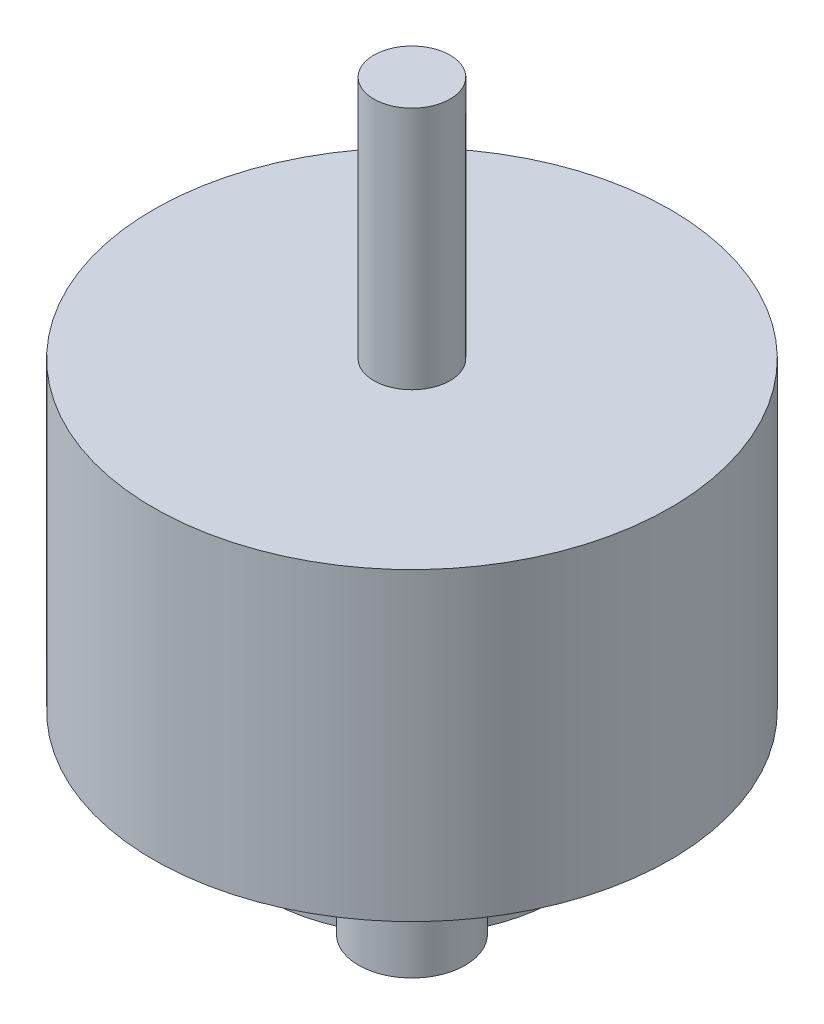
ISO-10303-21;
HEADER;
FILE_DESCRIPTION(('STEP AP214'),'2;1');
FILE_NAME('part.step','',(''),(''),'','','');
FILE_SCHEMA(('AUTOMOTIVE_DESIGN { 1 0 10303 214 1 1 1 1 }'));
ENDSEC;
DATA;
#1=APPLICATION_CONTEXT('core data for automotive mechanical design processes');
#2=APPLICATION_PROTOCOL_DEFINITION('international standard','automotive_design',2000,#1);
#3=PRODUCT_CONTEXT('',#1,'mechanical');
#4=PRODUCT('Part','Part','',(#3));
#5=PRODUCT_RELATED_PRODUCT_CATEGORY('part','',(#4));
#6=PRODUCT_DEFINITION_FORMATION('','',#4);
#7=PRODUCT_DEFINITION_CONTEXT('part definition',#1,'design');
#8=PRODUCT_DEFINITION('design','',#6,#7);
#9=PRODUCT_DEFINITION_SHAPE('','',#8);
#10=(LENGTH_UNIT() NAMED_UNIT(*) SI_UNIT(.MILLI.,.METRE.));
#11=(NAMED_UNIT(*) PLANE_ANGLE_UNIT() SI_UNIT($,.RADIAN.));
#12=(NAMED_UNIT(*) SI_UNIT($,.STERADIAN.) SOLID_ANGLE_UNIT());
#13=UNCERTAINTY_MEASURE_WITH_UNIT(LENGTH_MEASURE(1.E-05),#10,'distance_accuracy_value','');
#14=(GEOMETRIC_REPRESENTATION_CONTEXT(3) GLOBAL_UNCERTAINTY_ASSIGNED_CONTEXT((#13)) GLOBAL_UNIT_ASSIGNED_CONTEXT((#10,
#11,#12)) REPRESENTATION_CONTEXT('',''));
#15=CARTESIAN_POINT('',(0.,0.,0.));
#16=DIRECTION('',(0.,0.,1.));
#17=DIRECTION('',(1.,0.,0.));
#18=AXIS2_PLACEMENT_3D('',#15,#16,#17);
#19=CARTESIAN_POINT('',(0.,0.,0.));
#20=DIRECTION('',(0.,1.,0.));
#21=DIRECTION('',(0.,0.,1.));
#22=AXIS2_PLACEMENT_3D('',#19,#20,#21);
#23=PLANE('',#22);
#24=CARTESIAN_POINT('',(-6.71751442127217,0.,-6.71751442127224));
#25=DIRECTION('',(0.,-1.,0.));
#26=DIRECTION('',(0.,0.,-1.));
#27=AXIS2_PLACEMENT_3D('',#24,#25,#26);
#28=CIRCLE('',#27,1.7);
#29=CARTESIAN_POINT('',(-6.71751442127217,0.,-8.41751442127223));
#30=VERTEX_POINT('',#29);
#31=EDGE_CURVE('E212',#30,#30,#28,.T.);
#32=ORIENTED_EDGE('',*,*,#31,.F.);
#33=EDGE_LOOP('',(#32));
#34=FACE_BOUND('',#33,.T.);
#35=CARTESIAN_POINT('',(0.,0.,0.));
#36=DIRECTION('',(0.,-1.,0.));
#37=DIRECTION('',(0.,0.,-1.));
#38=AXIS2_PLACEMENT_3D('',#35,#36,#37);
#39=CIRCLE('',#38,9.5);
#40=CARTESIAN_POINT('',(-8.69413737876269,0.,3.82909587751488));
#41=VERTEX_POINT('',#40);
#42=CARTESIAN_POINT('',(-8.69413737876277,0.,-3.82909587751469));
#43=VERTEX_POINT('',#42);
#44=EDGE_CURVE('E11',#41,#43,#39,.T.);
#45=ORIENTED_EDGE('',*,*,#44,.T.);
#46=CARTESIAN_POINT('',(-6.71751442127231,0.,-6.7175144212721));
#47=DIRECTION('',(0.,-1.,0.));
#48=DIRECTION('',(0.,0.,-1.));
#49=AXIS2_PLACEMENT_3D('',#46,#47,#48);
#50=CIRCLE('',#49,3.5);
#51=CARTESIAN_POINT('',(-3.82909587751496,0.,-8.69413737876265));
#52=VERTEX_POINT('',#51);
#53=EDGE_CURVE('E118',#43,#52,#50,.T.);
#54=ORIENTED_EDGE('',*,*,#53,.T.);
#55=CARTESIAN_POINT('',(3.82909587751472,0.,-8.69413737876276));
#56=VERTEX_POINT('',#55);
#57=EDGE_CURVE('E44',#52,#56,#39,.T.);
#58=ORIENTED_EDGE('',*,*,#57,.T.);
#59=CARTESIAN_POINT('',(6.71751442127212,0.,-6.71751442127228));
#60=DIRECTION('',(0.,-1.,0.));
#61=DIRECTION('',(0.,0.,-1.));
#62=AXIS2_PLACEMENT_3D('',#59,#60,#61);
#63=CIRCLE('',#62,3.5);
#64=CARTESIAN_POINT('',(8.69413737876267,0.,-3.82909587751493));
#65=VERTEX_POINT('',#64);
#66=EDGE_CURVE('E115',#56,#65,#63,.T.);
#67=ORIENTED_EDGE('',*,*,#66,.T.);
#68=CARTESIAN_POINT('',(8.69413737876275,0.,3.82909587751475));
#69=VERTEX_POINT('',#68);
#70=EDGE_CURVE('E175',#65,#69,#39,.T.);
#71=ORIENTED_EDGE('',*,*,#70,.T.);
#72=CARTESIAN_POINT('',(6.71751442127226,0.,6.71751442127214));
#73=DIRECTION('',(0.,-1.,0.));
#74=DIRECTION('',(0.,0.,-1.));
#75=AXIS2_PLACEMENT_3D('',#72,#73,#74);
#76=CIRCLE('',#75,3.5);
#77=CARTESIAN_POINT('',(3.8290958775149,0.,8.69413737876268));
#78=VERTEX_POINT('',#77);
#79=EDGE_CURVE('E133',#69,#78,#76,.T.);
#80=ORIENTED_EDGE('',*,*,#79,.T.);
#81=CARTESIAN_POINT('',(-3.82909587751479,0.,8.69413737876273));
#82=VERTEX_POINT('',#81);
#83=EDGE_CURVE('E45',#78,#82,#39,.T.);
#84=ORIENTED_EDGE('',*,*,#83,.T.);
#85=CARTESIAN_POINT('',(-6.71751442127217,0.,6.71751442127224));
#86=DIRECTION('',(0.,-1.,0.));
#87=DIRECTION('',(0.,0.,-1.));
#88=AXIS2_PLACEMENT_3D('',#85,#86,#87);
#89=CIRCLE('',#88,3.5);
#90=EDGE_CURVE('E145',#82,#41,#89,.T.);
#91=ORIENTED_EDGE('',*,*,#90,.T.);
#92=EDGE_LOOP('',(#45,#54,#58,#67,#71,#80,#84,#91));
#93=FACE_BOUND('',#92,.T.);
#94=CARTESIAN_POINT('',(6.71751442127221,0.,-6.71751442127219));
#95=DIRECTION('',(0.,-1.,0.));
#96=DIRECTION('',(0.,0.,-1.));
#97=AXIS2_PLACEMENT_3D('',#94,#95,#96);
#98=CIRCLE('',#97,1.7);
#99=CARTESIAN_POINT('',(6.71751442127221,0.,-8.41751442127218));
#100=VERTEX_POINT('',#99);
#101=EDGE_CURVE('E218',#100,#100,#98,.T.);
#102=ORIENTED_EDGE('',*,*,#101,.F.);
#103=EDGE_LOOP('',(#102));
#104=FACE_BOUND('',#103,.T.);
#105=CARTESIAN_POINT('',(6.71751442127217,0.,6.71751442127224));
#106=DIRECTION('',(0.,-1.,0.));
#107=DIRECTION('',(0.,0.,-1.));
#108=AXIS2_PLACEMENT_3D('',#105,#106,#107);
#109=CIRCLE('',#108,1.7);
#110=CARTESIAN_POINT('',(6.71751442127217,0.,5.01751442127224));
#111=VERTEX_POINT('',#110);
#112=EDGE_CURVE('E226',#111,#111,#109,.T.);
#113=ORIENTED_EDGE('',*,*,#112,.F.);
#114=EDGE_LOOP('',(#113));
#115=FACE_BOUND('',#114,.T.);
#116=CARTESIAN_POINT('',(-6.71751442127217,0.,6.71751442127224));
#117=DIRECTION('',(0.,-1.,0.));
#118=DIRECTION('',(0.,0.,-1.));
#119=AXIS2_PLACEMENT_3D('',#116,#117,#118);
#120=CIRCLE('',#119,1.7);
#121=CARTESIAN_POINT('',(-6.71751442127217,0.,5.01751442127224));
#122=VERTEX_POINT('',#121);
#123=EDGE_CURVE('E232',#122,#122,#120,.T.);
#124=ORIENTED_EDGE('',*,*,#123,.F.);
#125=EDGE_LOOP('',(#124));
#126=FACE_BOUND('',#125,.T.);
#127=ADVANCED_FACE('F37',(#34,#93,#104,#115,#126),#23,.F.);
#128=CARTESIAN_POINT('',(0.,0.,0.));
#129=DIRECTION('',(0.,-1.,0.));
#130=DIRECTION('',(0.,0.,-1.));
#131=AXIS2_PLACEMENT_3D('',#128,#129,#130);
#132=CYLINDRICAL_SURFACE('',#131,9.5);
#133=ORIENTED_EDGE('',*,*,#57,.F.);
#134=DIRECTION('',(0.,-1.,0.));
#135=VECTOR('',#134,1.);
#136=CARTESIAN_POINT('',(-3.82909587751496,1.75,-8.69413737876265));
#137=LINE('',#136,#135);
#138=CARTESIAN_POINT('',(-3.82909587751496,3.5,-8.69413737876265));
#139=VERTEX_POINT('',#138);
#140=EDGE_CURVE('E110',#52,#139,#137,.F.);
#141=ORIENTED_EDGE('',*,*,#140,.T.);
#142=CARTESIAN_POINT('',(0.,3.5,0.));
#143=DIRECTION('',(0.,-1.,0.));
#144=DIRECTION('',(0.,0.,-1.));
#145=AXIS2_PLACEMENT_3D('',#142,#143,#144);
#146=CIRCLE('',#145,9.5);
#147=CARTESIAN_POINT('',(3.82909587751472,3.5,-8.69413737876276));
#148=VERTEX_POINT('',#147);
#149=EDGE_CURVE('E101',#139,#148,#146,.T.);
#150=ORIENTED_EDGE('',*,*,#149,.T.);
#151=DIRECTION('',(0.,-1.,0.));
#152=VECTOR('',#151,1.);
#153=CARTESIAN_POINT('',(3.82909587751472,1.75,-8.69413737876276));
#154=LINE('',#153,#152);
#155=EDGE_CURVE('E128',#148,#56,#154,.T.);
#156=ORIENTED_EDGE('',*,*,#155,.T.);
#157=EDGE_LOOP('',(#133,#141,#150,#156));
#158=FACE_BOUND('',#157,.T.);
#159=ADVANCED_FACE('F111',(#158),#132,.T.);
#160=ORIENTED_EDGE('',*,*,#70,.F.);
#161=DIRECTION('',(0.,-1.,0.));
#162=VECTOR('',#161,1.);
#163=CARTESIAN_POINT('',(8.69413737876267,1.75,-3.82909587751493));
#164=LINE('',#163,#162);
#165=CARTESIAN_POINT('',(8.69413737876267,3.5,-3.82909587751493));
#166=VERTEX_POINT('',#165);
#167=EDGE_CURVE('E130',#65,#166,#164,.F.);
#168=ORIENTED_EDGE('',*,*,#167,.T.);
#169=CARTESIAN_POINT('',(8.69413737876274,3.5,3.82909587751476));
#170=VERTEX_POINT('',#169);
#171=EDGE_CURVE('E109',#166,#170,#146,.T.);
#172=ORIENTED_EDGE('',*,*,#171,.T.);
#173=DIRECTION('',(0.,-1.,0.));
#174=VECTOR('',#173,1.);
#175=CARTESIAN_POINT('',(8.69413737876275,1.75,3.82909587751475));
#176=LINE('',#175,#174);
#177=EDGE_CURVE('E139',#170,#69,#176,.T.);
#178=ORIENTED_EDGE('',*,*,#177,.T.);
#179=EDGE_LOOP('',(#160,#168,#172,#178));
#180=FACE_BOUND('',#179,.T.);
#181=ADVANCED_FACE('F180',(#180),#132,.T.);
#182=ORIENTED_EDGE('',*,*,#83,.F.);
#183=DIRECTION('',(0.,-1.,0.));
#184=VECTOR('',#183,1.);
#185=CARTESIAN_POINT('',(3.8290958775149,1.75,8.69413737876268));
#186=LINE('',#185,#184);
#187=CARTESIAN_POINT('',(3.8290958775149,3.5,8.69413737876268));
#188=VERTEX_POINT('',#187);
#189=EDGE_CURVE('E142',#78,#188,#186,.F.);
#190=ORIENTED_EDGE('',*,*,#189,.T.);
#191=CARTESIAN_POINT('',(-3.82909587751479,3.5,8.69413737876273));
#192=VERTEX_POINT('',#191);
#193=EDGE_CURVE('E174',#188,#192,#146,.T.);
#194=ORIENTED_EDGE('',*,*,#193,.T.);
#195=DIRECTION('',(0.,-1.,0.));
#196=VECTOR('',#195,1.);
#197=CARTESIAN_POINT('',(-3.82909587751479,1.75,8.69413737876273));
#198=LINE('',#197,#196);
#199=EDGE_CURVE('E151',#192,#82,#198,.T.);
#200=ORIENTED_EDGE('',*,*,#199,.T.);
#201=EDGE_LOOP('',(#182,#190,#194,#200));
#202=FACE_BOUND('',#201,.T.);
#203=ADVANCED_FACE('F188',(#202),#132,.T.);
#204=CARTESIAN_POINT('',(-8.69413737876269,3.5,3.82909587751488));
#205=VERTEX_POINT('',#204);
#206=CARTESIAN_POINT('',(-8.69413737876277,3.5,-3.8290958775147));
#207=VERTEX_POINT('',#206);
#208=EDGE_CURVE('E108',#205,#207,#146,.T.);
#209=ORIENTED_EDGE('',*,*,#208,.T.);
#210=DIRECTION('',(0.,-1.,0.));
#211=VECTOR('',#210,1.);
#212=CARTESIAN_POINT('',(-8.69413737876277,1.75,-3.82909587751469));
#213=LINE('',#212,#211);
#214=EDGE_CURVE('E59',#207,#43,#213,.T.);
#215=ORIENTED_EDGE('',*,*,#214,.T.);
#216=ORIENTED_EDGE('',*,*,#44,.F.);
#217=DIRECTION('',(0.,-1.,0.));
#218=VECTOR('',#217,1.);
#219=CARTESIAN_POINT('',(-8.69413737876269,1.75,3.82909587751488));
#220=LINE('',#219,#218);
#221=EDGE_CURVE('E154',#41,#205,#220,.F.);
#222=ORIENTED_EDGE('',*,*,#221,.T.);
#223=EDGE_LOOP('',(#209,#215,#216,#222));
#224=FACE_BOUND('',#223,.T.);
#225=ADVANCED_FACE('F209',(#224),#132,.T.);
#226=CARTESIAN_POINT('',(-9.5,3.5,0.));
#227=DIRECTION('',(0.,-1.,0.));
#228=DIRECTION('',(0.,0.,-1.));
#229=AXIS2_PLACEMENT_3D('',#226,#227,#228);
#230=PLANE('',#229);
#231=CARTESIAN_POINT('',(-6.71751442127217,3.5,6.71751442127224));
#232=DIRECTION('',(0.,-1.,0.));
#233=DIRECTION('',(0.,0.,-1.));
#234=AXIS2_PLACEMENT_3D('',#231,#232,#233);
#235=CIRCLE('',#234,1.7);
#236=CARTESIAN_POINT('',(-6.71751442127217,3.5,5.01751442127224));
#237=VERTEX_POINT('',#236);
#238=EDGE_CURVE('E229',#237,#237,#235,.T.);
#239=ORIENTED_EDGE('',*,*,#238,.T.);
#240=EDGE_LOOP('',(#239));
#241=FACE_BOUND('',#240,.T.);
#242=CARTESIAN_POINT('',(6.71751442127217,3.5,6.71751442127224));
#243=DIRECTION('',(0.,-1.,0.));
#244=DIRECTION('',(0.,0.,-1.));
#245=AXIS2_PLACEMENT_3D('',#242,#243,#244);
#246=CIRCLE('',#245,1.7);
#247=CARTESIAN_POINT('',(6.71751442127217,3.5,5.01751442127224));
#248=VERTEX_POINT('',#247);
#249=EDGE_CURVE('E223',#248,#248,#246,.T.);
#250=ORIENTED_EDGE('',*,*,#249,.T.);
#251=EDGE_LOOP('',(#250));
#252=FACE_BOUND('',#251,.T.);
#253=CARTESIAN_POINT('',(6.71751442127221,3.5,-6.71751442127219));
#254=DIRECTION('',(0.,-1.,0.));
#255=DIRECTION('',(0.,0.,-1.));
#256=AXIS2_PLACEMENT_3D('',#253,#254,#255);
#257=CIRCLE('',#256,1.7);
#258=CARTESIAN_POINT('',(6.71751442127221,3.5,-8.41751442127219));
#259=VERTEX_POINT('',#258);
#260=EDGE_CURVE('E214',#259,#259,#257,.T.);
#261=ORIENTED_EDGE('',*,*,#260,.T.);
#262=EDGE_LOOP('',(#261));
#263=FACE_BOUND('',#262,.T.);
#264=CARTESIAN_POINT('',(-6.71751442127217,3.5,-6.71751442127224));
#265=DIRECTION('',(0.,-1.,0.));
#266=DIRECTION('',(0.,0.,-1.));
#267=AXIS2_PLACEMENT_3D('',#264,#265,#266);
#268=CIRCLE('',#267,1.7);
#269=CARTESIAN_POINT('',(-6.71751442127217,3.5,-8.41751442127224));
#270=VERTEX_POINT('',#269);
#271=EDGE_CURVE('E121',#270,#270,#268,.T.);
#272=ORIENTED_EDGE('',*,*,#271,.T.);
#273=EDGE_LOOP('',(#272));
#274=FACE_BOUND('',#273,.T.);
#275=CARTESIAN_POINT('',(0.,3.5,0.));
#276=DIRECTION('',(0.,-1.,0.));
#277=DIRECTION('',(0.,0.,-1.));
#278=AXIS2_PLACEMENT_3D('',#275,#276,#277);
#279=CIRCLE('',#278,7.5);
#280=CARTESIAN_POINT('',(0.,3.5,-7.5));
#281=VERTEX_POINT('',#280);
#282=EDGE_CURVE('E172',#281,#281,#279,.T.);
#283=ORIENTED_EDGE('',*,*,#282,.T.);
#284=EDGE_LOOP('',(#283));
#285=FACE_BOUND('',#284,.T.);
#286=ORIENTED_EDGE('',*,*,#149,.F.);
#287=CARTESIAN_POINT('',(-6.71751442127231,3.5,-6.7175144212721));
#288=DIRECTION('',(0.,-1.,0.));
#289=DIRECTION('',(0.,0.,-1.));
#290=AXIS2_PLACEMENT_3D('',#287,#288,#289);
#291=CIRCLE('',#290,3.5);
#292=EDGE_CURVE('E104',#139,#207,#291,.F.);
#293=ORIENTED_EDGE('',*,*,#292,.T.);
#294=ORIENTED_EDGE('',*,*,#208,.F.);
#295=CARTESIAN_POINT('',(-6.71751442127217,3.5,6.71751442127224));
#296=DIRECTION('',(0.,-1.,0.));
#297=DIRECTION('',(0.,0.,-1.));
#298=AXIS2_PLACEMENT_3D('',#295,#296,#297);
#299=CIRCLE('',#298,3.5);
#300=EDGE_CURVE('E148',#205,#192,#299,.F.);
#301=ORIENTED_EDGE('',*,*,#300,.T.);
#302=ORIENTED_EDGE('',*,*,#193,.F.);
#303=CARTESIAN_POINT('',(6.71751442127226,3.5,6.71751442127214));
#304=DIRECTION('',(0.,-1.,0.));
#305=DIRECTION('',(0.,0.,-1.));
#306=AXIS2_PLACEMENT_3D('',#303,#304,#305);
#307=CIRCLE('',#306,3.5);
#308=EDGE_CURVE('E136',#188,#170,#307,.F.);
#309=ORIENTED_EDGE('',*,*,#308,.T.);
#310=ORIENTED_EDGE('',*,*,#171,.F.);
#311=CARTESIAN_POINT('',(6.71751442127212,3.5,-6.71751442127228));
#312=DIRECTION('',(0.,-1.,0.));
#313=DIRECTION('',(0.,0.,-1.));
#314=AXIS2_PLACEMENT_3D('',#311,#312,#313);
#315=CIRCLE('',#314,3.5);
#316=EDGE_CURVE('E106',#166,#148,#315,.F.);
#317=ORIENTED_EDGE('',*,*,#316,.T.);
#318=EDGE_LOOP('',(#286,#293,#294,#301,#302,#309,#310,#317));
#319=FACE_BOUND('',#318,.T.);
#320=ADVANCED_FACE('F102',(#241,#252,#263,#274,#285,#319),#230,.F.);
#321=CARTESIAN_POINT('',(0.,6.,0.));
#322=DIRECTION('',(0.,-1.,0.));
#323=DIRECTION('',(0.,0.,-1.));
#324=AXIS2_PLACEMENT_3D('',#321,#322,#323);
#325=CONICAL_SURFACE('',#324,6.95,0.216550304976089);
#326=ORIENTED_EDGE('',*,*,#282,.F.);
#327=EDGE_LOOP('',(#326));
#328=FACE_BOUND('',#327,.T.);
#329=CARTESIAN_POINT('',(0.,6.,0.));
#330=DIRECTION('',(0.,-1.,0.));
#331=DIRECTION('',(0.,0.,-1.));
#332=AXIS2_PLACEMENT_3D('',#329,#330,#331);
#333=CIRCLE('',#332,6.95);
#334=CARTESIAN_POINT('',(0.,6.,-6.95));
#335=VERTEX_POINT('',#334);
#336=EDGE_CURVE('E169',#335,#335,#333,.T.);
#337=ORIENTED_EDGE('',*,*,#336,.T.);
#338=EDGE_LOOP('',(#337));
#339=FACE_BOUND('',#338,.T.);
#340=ADVANCED_FACE('F261',(#328,#339),#325,.T.);
#341=CARTESIAN_POINT('',(-6.95,6.,0.));
#342=DIRECTION('',(0.,1.,0.));
#343=DIRECTION('',(0.,0.,1.));
#344=AXIS2_PLACEMENT_3D('',#341,#342,#343);
#345=PLANE('',#344);
#346=ORIENTED_EDGE('',*,*,#336,.F.);
#347=EDGE_LOOP('',(#346));
#348=FACE_BOUND('',#347,.T.);
#349=CARTESIAN_POINT('',(0.,6.,0.));
#350=DIRECTION('',(0.,-1.,0.));
#351=DIRECTION('',(0.,0.,-1.));
#352=AXIS2_PLACEMENT_3D('',#349,#350,#351);
#353=CIRCLE('',#352,16.95);
#354=CARTESIAN_POINT('',(0.,6.,-16.95));
#355=VERTEX_POINT('',#354);
#356=EDGE_CURVE('E166',#355,#355,#353,.T.);
#357=ORIENTED_EDGE('',*,*,#356,.T.);
#358=EDGE_LOOP('',(#357));
#359=FACE_BOUND('',#358,.T.);
#360=ADVANCED_FACE('F268',(#348,#359),#345,.F.);
#361=CARTESIAN_POINT('',(0.,0.,0.));
#362=DIRECTION('',(0.,-1.,0.));
#363=DIRECTION('',(0.,0.,-1.));
#364=AXIS2_PLACEMENT_3D('',#361,#362,#363);
#365=CYLINDRICAL_SURFACE('',#364,16.95);
#366=ORIENTED_EDGE('',*,*,#356,.F.);
#367=EDGE_LOOP('',(#366));
#368=FACE_BOUND('',#367,.T.);
#369=CARTESIAN_POINT('',(0.,26.,0.));
#370=DIRECTION('',(0.,-1.,0.));
#371=DIRECTION('',(0.,0.,-1.));
#372=AXIS2_PLACEMENT_3D('',#369,#370,#371);
#373=CIRCLE('',#372,16.95);
#374=CARTESIAN_POINT('',(0.,26.,-16.95));
#375=VERTEX_POINT('',#374);
#376=EDGE_CURVE('E163',#375,#375,#373,.T.);
#377=ORIENTED_EDGE('',*,*,#376,.T.);
#378=EDGE_LOOP('',(#377));
#379=FACE_BOUND('',#378,.T.);
#380=ADVANCED_FACE('F274',(#368,#379),#365,.T.);
#381=CARTESIAN_POINT('',(-16.95,26.,0.));
#382=DIRECTION('',(0.,-1.,0.));
#383=DIRECTION('',(0.,0.,-1.));
#384=AXIS2_PLACEMENT_3D('',#381,#382,#383);
#385=PLANE('',#384);
#386=ORIENTED_EDGE('',*,*,#376,.F.);
#387=EDGE_LOOP('',(#386));
#388=FACE_BOUND('',#387,.T.);
#389=CARTESIAN_POINT('',(0.,26.,0.));
#390=DIRECTION('',(0.,-1.,0.));
#391=DIRECTION('',(0.,0.,-1.));
#392=AXIS2_PLACEMENT_3D('',#389,#390,#391);
#393=CIRCLE('',#392,2.5);
#394=CARTESIAN_POINT('',(0.,26.,-2.5));
#395=VERTEX_POINT('',#394);
#396=EDGE_CURVE('E160',#395,#395,#393,.T.);
#397=ORIENTED_EDGE('',*,*,#396,.T.);
#398=EDGE_LOOP('',(#397));
#399=FACE_BOUND('',#398,.T.);
#400=ADVANCED_FACE('F280',(#388,#399),#385,.F.);
#401=CARTESIAN_POINT('',(0.,0.,0.));
#402=DIRECTION('',(0.,-1.,0.));
#403=DIRECTION('',(0.,0.,-1.));
#404=AXIS2_PLACEMENT_3D('',#401,#402,#403);
#405=CYLINDRICAL_SURFACE('',#404,2.5);
#406=ORIENTED_EDGE('',*,*,#396,.F.);
#407=EDGE_LOOP('',(#406));
#408=FACE_BOUND('',#407,.T.);
#409=CARTESIAN_POINT('',(0.,42.,0.));
#410=DIRECTION('',(0.,-1.,0.));
#411=DIRECTION('',(0.,0.,-1.));
#412=AXIS2_PLACEMENT_3D('',#409,#410,#411);
#413=CIRCLE('',#412,2.5);
#414=CARTESIAN_POINT('',(0.,42.,-2.5));
#415=VERTEX_POINT('',#414);
#416=EDGE_CURVE('E157',#415,#415,#413,.T.);
#417=ORIENTED_EDGE('',*,*,#416,.T.);
#418=EDGE_LOOP('',(#417));
#419=FACE_BOUND('',#418,.T.);
#420=ADVANCED_FACE('F286',(#408,#419),#405,.T.);
#421=CARTESIAN_POINT('',(-2.5,42.,0.));
#422=DIRECTION('',(0.,-1.,0.));
#423=DIRECTION('',(0.,0.,-1.));
#424=AXIS2_PLACEMENT_3D('',#421,#422,#423);
#425=PLANE('',#424);
#426=ORIENTED_EDGE('',*,*,#416,.F.);
#427=EDGE_LOOP('',(#426));
#428=FACE_BOUND('',#427,.T.);
#429=ADVANCED_FACE('F292',(#428),#425,.F.);
#430=CARTESIAN_POINT('',(-6.71751442127217,13.3994949366117,6.71751442127224));
#431=DIRECTION('',(0.,-1.,0.));
#432=DIRECTION('',(0.,0.,-1.));
#433=AXIS2_PLACEMENT_3D('',#430,#431,#432);
#434=CYLINDRICAL_SURFACE('',#433,3.5);
#435=ORIENTED_EDGE('',*,*,#221,.F.);
#436=ORIENTED_EDGE('',*,*,#90,.F.);
#437=ORIENTED_EDGE('',*,*,#199,.F.);
#438=ORIENTED_EDGE('',*,*,#300,.F.);
#439=EDGE_LOOP('',(#435,#436,#437,#438));
#440=FACE_BOUND('',#439,.T.);
#441=ADVANCED_FACE('F202',(#440),#434,.T.);
#442=CARTESIAN_POINT('',(6.71751442127226,13.3994949366117,6.71751442127214));
#443=DIRECTION('',(0.,-1.,0.));
#444=DIRECTION('',(0.,0.,-1.));
#445=AXIS2_PLACEMENT_3D('',#442,#443,#444);
#446=CYLINDRICAL_SURFACE('',#445,3.5);
#447=ORIENTED_EDGE('',*,*,#189,.F.);
#448=ORIENTED_EDGE('',*,*,#79,.F.);
#449=ORIENTED_EDGE('',*,*,#177,.F.);
#450=ORIENTED_EDGE('',*,*,#308,.F.);
#451=EDGE_LOOP('',(#447,#448,#449,#450));
#452=FACE_BOUND('',#451,.T.);
#453=ADVANCED_FACE('F186',(#452),#446,.T.);
#454=CARTESIAN_POINT('',(6.71751442127212,13.3994949366117,-6.71751442127228));
#455=DIRECTION('',(0.,-1.,0.));
#456=DIRECTION('',(0.,0.,-1.));
#457=AXIS2_PLACEMENT_3D('',#454,#455,#456);
#458=CYLINDRICAL_SURFACE('',#457,3.5);
#459=ORIENTED_EDGE('',*,*,#167,.F.);
#460=ORIENTED_EDGE('',*,*,#66,.F.);
#461=ORIENTED_EDGE('',*,*,#155,.F.);
#462=ORIENTED_EDGE('',*,*,#316,.F.);
#463=EDGE_LOOP('',(#459,#460,#461,#462));
#464=FACE_BOUND('',#463,.T.);
#465=ADVANCED_FACE('F193',(#464),#458,.T.);
#466=CARTESIAN_POINT('',(-6.71751442127231,13.3994949366117,-6.7175144212721));
#467=DIRECTION('',(0.,-1.,0.));
#468=DIRECTION('',(0.,0.,-1.));
#469=AXIS2_PLACEMENT_3D('',#466,#467,#468);
#470=CYLINDRICAL_SURFACE('',#469,3.5);
#471=ORIENTED_EDGE('',*,*,#140,.F.);
#472=ORIENTED_EDGE('',*,*,#53,.F.);
#473=ORIENTED_EDGE('',*,*,#214,.F.);
#474=ORIENTED_EDGE('',*,*,#292,.F.);
#475=EDGE_LOOP('',(#471,#472,#473,#474));
#476=FACE_BOUND('',#475,.T.);
#477=ADVANCED_FACE('F117',(#476),#470,.T.);
#478=CARTESIAN_POINT('',(-6.71751442127217,0.,-6.71751442127224));
#479=DIRECTION('',(0.,-1.,0.));
#480=DIRECTION('',(0.,0.,-1.));
#481=AXIS2_PLACEMENT_3D('',#478,#479,#480);
#482=CYLINDRICAL_SURFACE('',#481,1.7);
#483=ORIENTED_EDGE('',*,*,#271,.F.);
#484=EDGE_LOOP('',(#483));
#485=FACE_BOUND('',#484,.T.);
#486=ORIENTED_EDGE('',*,*,#31,.T.);
#487=EDGE_LOOP('',(#486));
#488=FACE_BOUND('',#487,.T.);
#489=ADVANCED_FACE('F200',(#485,#488),#482,.F.);
#490=CARTESIAN_POINT('',(6.71751442127221,0.,-6.71751442127219));
#491=DIRECTION('',(0.,-1.,0.));
#492=DIRECTION('',(0.,0.,-1.));
#493=AXIS2_PLACEMENT_3D('',#490,#491,#492);
#494=CYLINDRICAL_SURFACE('',#493,1.7);
#495=ORIENTED_EDGE('',*,*,#260,.F.);
#496=EDGE_LOOP('',(#495));
#497=FACE_BOUND('',#496,.T.);
#498=ORIENTED_EDGE('',*,*,#101,.T.);
#499=EDGE_LOOP('',(#498));
#500=FACE_BOUND('',#499,.T.);
#501=ADVANCED_FACE('F245',(#497,#500),#494,.F.);
#502=CARTESIAN_POINT('',(6.71751442127217,0.,6.71751442127224));
#503=DIRECTION('',(0.,-1.,0.));
#504=DIRECTION('',(0.,0.,-1.));
#505=AXIS2_PLACEMENT_3D('',#502,#503,#504);
#506=CYLINDRICAL_SURFACE('',#505,1.7);
#507=ORIENTED_EDGE('',*,*,#249,.F.);
#508=EDGE_LOOP('',(#507));
#509=FACE_BOUND('',#508,.T.);
#510=ORIENTED_EDGE('',*,*,#112,.T.);
#511=EDGE_LOOP('',(#510));
#512=FACE_BOUND('',#511,.T.);
#513=ADVANCED_FACE('F239',(#509,#512),#506,.F.);
#514=CARTESIAN_POINT('',(-6.71751442127217,0.,6.71751442127224));
#515=DIRECTION('',(0.,-1.,0.));
#516=DIRECTION('',(0.,0.,-1.));
#517=AXIS2_PLACEMENT_3D('',#514,#515,#516);
#518=CYLINDRICAL_SURFACE('',#517,1.7);
#519=ORIENTED_EDGE('',*,*,#238,.F.);
#520=EDGE_LOOP('',(#519));
#521=FACE_BOUND('',#520,.T.);
#522=ORIENTED_EDGE('',*,*,#123,.T.);
#523=EDGE_LOOP('',(#522));
#524=FACE_BOUND('',#523,.T.);
#525=ADVANCED_FACE('F236',(#521,#524),#518,.F.);
#526=CLOSED_SHELL('',(#127,#159,#181,#203,#225,#320,#340,#360,#380,#400,#420,#429,#441,#453,
#465,#477,#489,#501,#513,#525));
#527=MANIFOLD_SOLID_BREP('B2',#526);
#528=ADVANCED_BREP_SHAPE_REPRESENTATION('',(#18,#527),#14);
#529=SHAPE_DEFINITION_REPRESENTATION(#9,#528);
ENDSEC;
END-ISO-10303-21;
